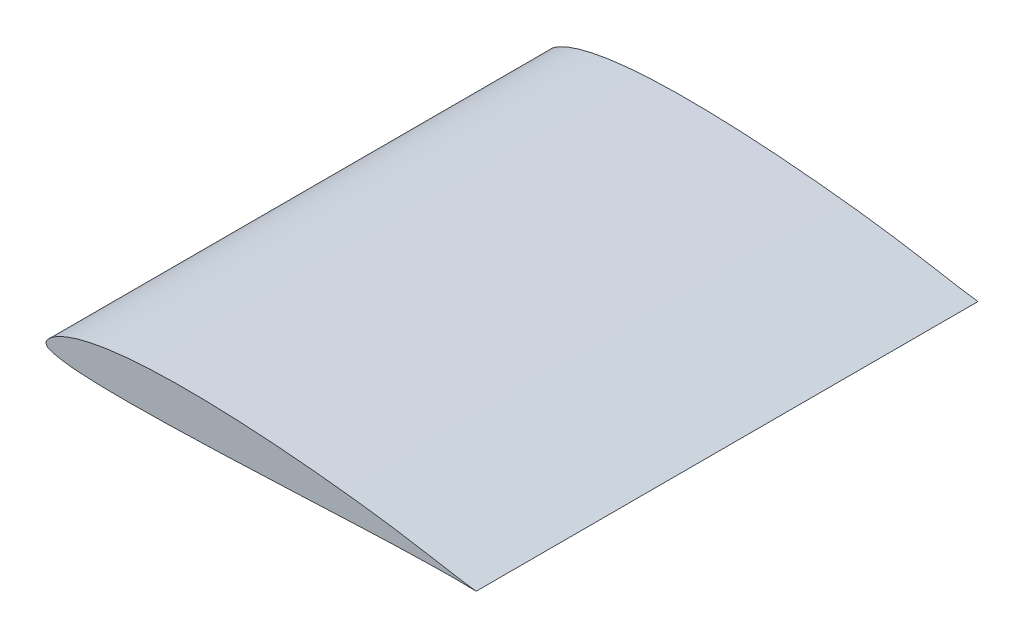
ISO-10303-21;
HEADER;
FILE_DESCRIPTION(('STEP AP214'),'2;1');
FILE_NAME('part.step','',(''),(''),'','','');
FILE_SCHEMA(('AUTOMOTIVE_DESIGN { 1 0 10303 214 1 1 1 1 }'));
ENDSEC;
DATA;
#1=APPLICATION_CONTEXT('core data for automotive mechanical design processes');
#2=APPLICATION_PROTOCOL_DEFINITION('international standard','automotive_design',2000,#1);
#3=PRODUCT_CONTEXT('',#1,'mechanical');
#4=PRODUCT('Part','Part','',(#3));
#5=PRODUCT_RELATED_PRODUCT_CATEGORY('part','',(#4));
#6=PRODUCT_DEFINITION_FORMATION('','',#4);
#7=PRODUCT_DEFINITION_CONTEXT('part definition',#1,'design');
#8=PRODUCT_DEFINITION('design','',#6,#7);
#9=PRODUCT_DEFINITION_SHAPE('','',#8);
#10=(LENGTH_UNIT() NAMED_UNIT(*) SI_UNIT(.MILLI.,.METRE.));
#11=(NAMED_UNIT(*) PLANE_ANGLE_UNIT() SI_UNIT($,.RADIAN.));
#12=(NAMED_UNIT(*) SI_UNIT($,.STERADIAN.) SOLID_ANGLE_UNIT());
#13=UNCERTAINTY_MEASURE_WITH_UNIT(LENGTH_MEASURE(1.E-05),#10,'distance_accuracy_value','');
#14=(GEOMETRIC_REPRESENTATION_CONTEXT(3) GLOBAL_UNCERTAINTY_ASSIGNED_CONTEXT((#13)) GLOBAL_UNIT_ASSIGNED_CONTEXT((#10,
#11,#12)) REPRESENTATION_CONTEXT('',''));
#15=CARTESIAN_POINT('',(0.,0.,0.));
#16=DIRECTION('',(0.,0.,1.));
#17=DIRECTION('',(1.,0.,0.));
#18=AXIS2_PLACEMENT_3D('',#15,#16,#17);
#19=CARTESIAN_POINT('',(151.898604,0.02286,177.8));
#20=DIRECTION('',(0.0455453922574668,0.998962270180468,0.));
#21=DIRECTION('',(-0.998962270180468,0.0455453922574668,0.));
#22=AXIS2_PLACEMENT_3D('',#19,#20,#21);
#23=PLANE('',#22);
#24=CARTESIAN_POINT('',(151.898604,0.02286,0.));
#25=CARTESIAN_POINT('',(152.4,0.,0.));
#26=B_SPLINE_CURVE_WITH_KNOTS('',1,(#24,#25),.UNSPECIFIED.,.F.,.F.,(2,2),(0.,1.),.UNSPECIFIED.);
#27=CARTESIAN_POINT('',(151.898604,0.02286,0.));
#28=VERTEX_POINT('',#27);
#29=CARTESIAN_POINT('',(152.4,0.,0.));
#30=VERTEX_POINT('',#29);
#31=EDGE_CURVE('E74',#28,#30,#26,.T.);
#32=ORIENTED_EDGE('',*,*,#31,.T.);
#33=DIRECTION('',(0.,0.,-1.));
#34=VECTOR('',#33,1.);
#35=CARTESIAN_POINT('',(152.4,0.,177.8));
#36=LINE('',#35,#34);
#37=CARTESIAN_POINT('',(152.4,0.,177.8));
#38=VERTEX_POINT('',#37);
#39=EDGE_CURVE('E11',#38,#30,#36,.T.);
#40=ORIENTED_EDGE('',*,*,#39,.F.);
#41=CARTESIAN_POINT('',(151.898604,0.02286,177.8));
#42=CARTESIAN_POINT('',(152.4,0.,177.8));
#43=B_SPLINE_CURVE_WITH_KNOTS('',1,(#41,#42),.UNSPECIFIED.,.F.,.F.,(2,2),(0.,1.),.UNSPECIFIED.);
#44=CARTESIAN_POINT('',(151.898604,0.02286,177.8));
#45=VERTEX_POINT('',#44);
#46=EDGE_CURVE('E73',#45,#38,#43,.T.);
#47=ORIENTED_EDGE('',*,*,#46,.F.);
#48=DIRECTION('',(0.,0.,-1.));
#49=VECTOR('',#48,1.);
#50=CARTESIAN_POINT('',(151.898604,0.02286,177.8));
#51=LINE('',#50,#49);
#52=EDGE_CURVE('E51',#45,#28,#51,.T.);
#53=ORIENTED_EDGE('',*,*,#52,.T.);
#54=EDGE_LOOP('',(#32,#40,#47,#53));
#55=FACE_BOUND('',#54,.T.);
#56=ADVANCED_FACE('F43',(#55),#23,.F.);
#57=CARTESIAN_POINT('',(152.4,0.,177.8));
#58=CARTESIAN_POINT('',(152.232833718495,0.0185024145844094,177.8));
#59=CARTESIAN_POINT('',(151.571843934071,0.0916625454276125,177.8));
#60=CARTESIAN_POINT('',(150.11399955714,0.283859600165364,177.8));
#61=CARTESIAN_POINT('',(147.749385864208,0.638650628689324,177.8));
#62=CARTESIAN_POINT('',(144.555943785527,1.17015700229937,177.8));
#63=CARTESIAN_POINT('',(140.615360499081,1.85909924705757,177.8));
#64=CARTESIAN_POINT('',(136.007834995224,2.67146012975516,177.8));
#65=CARTESIAN_POINT('',(130.806388018581,3.56284001663103,177.8));
#66=CARTESIAN_POINT('',(125.073826155466,4.48615477740971,177.8));
#67=CARTESIAN_POINT('',(118.8646901353,5.39775327756707,177.8));
#68=CARTESIAN_POINT('',(112.233312125261,6.27297423591478,177.8));
#69=CARTESIAN_POINT('',(105.243489487442,7.10605889156724,177.8));
#70=CARTESIAN_POINT('',(97.9696654062804,7.88931969327321,177.8));
#71=CARTESIAN_POINT('',(90.4927249927246,8.60673485806436,177.8));
#72=CARTESIAN_POINT('',(82.8952532405217,9.2406702507931,177.8));
#73=CARTESIAN_POINT('',(75.2586679023908,9.77749908015344,177.8));
#74=CARTESIAN_POINT('',(67.6629284232157,10.1988157178373,177.8));
#75=CARTESIAN_POINT('',(60.1868274986299,10.4917010195868,177.8));
#76=CARTESIAN_POINT('',(52.9059459542408,10.6450800985298,177.8));
#77=CARTESIAN_POINT('',(45.8917437129946,10.6445518064523,177.8));
#78=CARTESIAN_POINT('',(39.2106810479072,10.4862475970987,177.8));
#79=CARTESIAN_POINT('',(32.923263797137,10.1644127111138,177.8));
#80=CARTESIAN_POINT('',(27.0837008540271,9.67093972647032,177.8));
#81=CARTESIAN_POINT('',(21.737197539699,9.01650809069112,177.8));
#82=CARTESIAN_POINT('',(16.9243447592619,8.20408197388868,177.8));
#83=CARTESIAN_POINT('',(12.6762753048712,7.24977047946681,177.8));
#84=CARTESIAN_POINT('',(9.01981569255257,6.17445777095632,177.8));
#85=CARTESIAN_POINT('',(5.96569481917708,5.00201852215155,177.8));
#86=CARTESIAN_POINT('',(3.54403253695888,3.76987152616717,177.8));
#87=CARTESIAN_POINT('',(1.70483470840094,2.53149972603197,177.8));
#88=CARTESIAN_POINT('',(0.575239505776366,1.34473752883143,177.8));
#89=CARTESIAN_POINT('',(-0.170728015466049,0.203106959768801,177.8));
#90=CARTESIAN_POINT('',(0.337603285303623,-1.00177222805816,177.8));
#91=CARTESIAN_POINT('',(1.79294322608063,-1.54672679451716,177.8));
#92=CARTESIAN_POINT('',(3.794232234597,-2.17716445974196,177.8));
#93=CARTESIAN_POINT('',(6.64340020089969,-2.64392231576436,177.8));
#94=CARTESIAN_POINT('',(10.2161106536038,-3.04195363150428,177.8));
#95=CARTESIAN_POINT('',(14.5300841872538,-3.31987222771604,177.8));
#96=CARTESIAN_POINT('',(19.5339696288078,-3.49767725483492,177.8));
#97=CARTESIAN_POINT('',(25.1869220599411,-3.57763834503169,177.8));
#98=CARTESIAN_POINT('',(31.42862727455,-3.57384808178261,177.8));
#99=CARTESIAN_POINT('',(38.191948203283,-3.49658144160037,177.8));
#100=CARTESIAN_POINT('',(45.4015953170636,-3.34930898576548,177.8));
#101=CARTESIAN_POINT('',(52.9784172595709,-3.14184128811128,177.8));
#102=CARTESIAN_POINT('',(60.8386741403337,-2.88526226056694,177.8));
#103=CARTESIAN_POINT('',(68.8949884243473,-2.58793090460575,177.8));
#104=CARTESIAN_POINT('',(77.057432025165,-2.25888288701279,177.8));
#105=CARTESIAN_POINT('',(85.2350096722083,-1.90773028344113,177.8));
#106=CARTESIAN_POINT('',(93.3354268335371,-1.55016881909302,177.8));
#107=CARTESIAN_POINT('',(101.266049648543,-1.19546522084977,177.8));
#108=CARTESIAN_POINT('',(108.934170809505,-0.862411005508114,177.8));
#109=CARTESIAN_POINT('',(116.246498600348,-0.557504044589403,177.8));
#110=CARTESIAN_POINT('',(123.110150898588,-0.3069361826572,177.8));
#111=CARTESIAN_POINT('',(129.431690532645,-0.107922528146747,177.8));
#112=CARTESIAN_POINT('',(135.123521438346,0.0279744509983298,177.8));
#113=CARTESIAN_POINT('',(140.103603919286,0.108900524885163,177.8));
#114=CARTESIAN_POINT('',(144.299415419815,0.139938590331548,177.8));
#115=CARTESIAN_POINT('',(147.644768246445,0.124243060792821,177.8));
#116=CARTESIAN_POINT('',(150.083437285214,0.0865028877410205,177.8));
#117=CARTESIAN_POINT('',(151.399782071317,0.0403495604636981,177.8));
#118=CARTESIAN_POINT('',(151.898604,0.02286,177.8));
#119=B_SPLINE_CURVE_WITH_KNOTS('',3,(#57,#58,#59,#60,#61,#62,#63,#64,#65,#66,#67,#68,#69,#70,
#71,#72,#73,#74,#75,#76,#77,#78,#79,#80,#81,#82,#83,#84,#85,#86,#87,#88,#89,#90,#91,#92,#93,#94,
#95,#96,#97,#98,#99,#100,#101,#102,#103,#104,#105,#106,#107,#108,#109,#110,#111,#112,#113,#114,
#115,#116,#117,#118),.UNSPECIFIED.,.F.,.F.,(4,1,1,1,1,1,1,1,1,1,1,1,1,1,1,1,1,1,1,1,1,1,1,1,1,1,
1,1,1,1,1,1,1,1,1,1,1,1,1,1,1,1,1,1,1,1,1,1,1,1,1,1,1,1,1,1,1,1,1,4),(0.,0.00163535583425865,
0.00646633693476808,0.0142965918772176,0.0248842088552096,0.0379439925510076,0.0531941368467982,
0.0703765688743697,0.0892572179770476,0.109651763058439,0.131396199224683,0.154294670265703,
0.178096902835303,0.202530723472683,0.227328973387424,0.25222580652472,0.276966075496197,
0.301296827478668,0.324972088966137,0.347773045551505,0.369493848961825,0.389946984550237,
0.40897941596321,0.426465789850067,0.442306728816157,0.456421239565711,0.46877353813753,
0.47934514980936,0.488155641306995,0.495223141471028,0.500608247512498,0.504417035913407,
0.507344225330662,0.511892730711683,0.518766332626908,0.528062399813873,0.5397504852938,
0.553781923901918,0.570059197087642,0.588441486429501,0.608747967256935,0.630750043644814,
0.654207709776473,0.678865071069041,0.704450570233279,0.73067750330715,0.757253936726054,
0.783882586633168,0.810265561255861,0.836095192051152,0.861073222293053,0.884896986100605,
0.907258357413886,0.927856250220039,0.946394646161361,0.962618153964165,0.976286171395788,
0.987192827864271,0.995146789524168,1.),.UNSPECIFIED.);
#120=DIRECTION('',(0.,0.,-1.));
#121=VECTOR('',#120,1.);
#122=SURFACE_OF_LINEAR_EXTRUSION('',#119,#121);
#123=CARTESIAN_POINT('',(152.4,0.,0.));
#124=CARTESIAN_POINT('',(152.232833718495,0.0185024145844094,0.));
#125=CARTESIAN_POINT('',(151.571843934071,0.0916625454276125,0.));
#126=CARTESIAN_POINT('',(150.11399955714,0.283859600165364,0.));
#127=CARTESIAN_POINT('',(147.749385864208,0.638650628689324,0.));
#128=CARTESIAN_POINT('',(144.555943785527,1.17015700229937,0.));
#129=CARTESIAN_POINT('',(140.615360499081,1.85909924705757,0.));
#130=CARTESIAN_POINT('',(136.007834995224,2.67146012975516,0.));
#131=CARTESIAN_POINT('',(130.806388018581,3.56284001663103,0.));
#132=CARTESIAN_POINT('',(125.073826155466,4.48615477740971,0.));
#133=CARTESIAN_POINT('',(118.8646901353,5.39775327756707,0.));
#134=CARTESIAN_POINT('',(112.233312125261,6.27297423591478,0.));
#135=CARTESIAN_POINT('',(105.243489487442,7.10605889156724,0.));
#136=CARTESIAN_POINT('',(97.9696654062804,7.88931969327321,0.));
#137=CARTESIAN_POINT('',(90.4927249927246,8.60673485806436,0.));
#138=CARTESIAN_POINT('',(82.8952532405217,9.2406702507931,0.));
#139=CARTESIAN_POINT('',(75.2586679023908,9.77749908015344,0.));
#140=CARTESIAN_POINT('',(67.6629284232157,10.1988157178373,0.));
#141=CARTESIAN_POINT('',(60.1868274986299,10.4917010195868,0.));
#142=CARTESIAN_POINT('',(52.9059459542408,10.6450800985298,0.));
#143=CARTESIAN_POINT('',(45.8917437129946,10.6445518064523,0.));
#144=CARTESIAN_POINT('',(39.2106810479072,10.4862475970987,0.));
#145=CARTESIAN_POINT('',(32.923263797137,10.1644127111138,0.));
#146=CARTESIAN_POINT('',(27.0837008540271,9.67093972647032,0.));
#147=CARTESIAN_POINT('',(21.737197539699,9.01650809069112,0.));
#148=CARTESIAN_POINT('',(16.9243447592619,8.20408197388868,0.));
#149=CARTESIAN_POINT('',(12.6762753048712,7.24977047946681,0.));
#150=CARTESIAN_POINT('',(9.01981569255257,6.17445777095632,0.));
#151=CARTESIAN_POINT('',(5.96569481917708,5.00201852215155,0.));
#152=CARTESIAN_POINT('',(3.54403253695888,3.76987152616717,0.));
#153=CARTESIAN_POINT('',(1.70483470840094,2.53149972603197,0.));
#154=CARTESIAN_POINT('',(0.575239505776366,1.34473752883143,0.));
#155=CARTESIAN_POINT('',(-0.170728015466049,0.203106959768801,0.));
#156=CARTESIAN_POINT('',(0.337603285303623,-1.00177222805816,0.));
#157=CARTESIAN_POINT('',(1.79294322608063,-1.54672679451716,0.));
#158=CARTESIAN_POINT('',(3.794232234597,-2.17716445974196,0.));
#159=CARTESIAN_POINT('',(6.64340020089969,-2.64392231576436,0.));
#160=CARTESIAN_POINT('',(10.2161106536038,-3.04195363150428,0.));
#161=CARTESIAN_POINT('',(14.5300841872538,-3.31987222771604,0.));
#162=CARTESIAN_POINT('',(19.5339696288078,-3.49767725483492,0.));
#163=CARTESIAN_POINT('',(25.1869220599411,-3.57763834503169,0.));
#164=CARTESIAN_POINT('',(31.42862727455,-3.57384808178261,0.));
#165=CARTESIAN_POINT('',(38.191948203283,-3.49658144160037,0.));
#166=CARTESIAN_POINT('',(45.4015953170636,-3.34930898576548,0.));
#167=CARTESIAN_POINT('',(52.9784172595709,-3.14184128811128,0.));
#168=CARTESIAN_POINT('',(60.8386741403337,-2.88526226056694,0.));
#169=CARTESIAN_POINT('',(68.8949884243473,-2.58793090460575,0.));
#170=CARTESIAN_POINT('',(77.057432025165,-2.25888288701279,0.));
#171=CARTESIAN_POINT('',(85.2350096722083,-1.90773028344113,0.));
#172=CARTESIAN_POINT('',(93.3354268335371,-1.55016881909302,0.));
#173=CARTESIAN_POINT('',(101.266049648543,-1.19546522084977,0.));
#174=CARTESIAN_POINT('',(108.934170809505,-0.862411005508114,0.));
#175=CARTESIAN_POINT('',(116.246498600348,-0.557504044589403,0.));
#176=CARTESIAN_POINT('',(123.110150898588,-0.3069361826572,0.));
#177=CARTESIAN_POINT('',(129.431690532645,-0.107922528146747,0.));
#178=CARTESIAN_POINT('',(135.123521438346,0.0279744509983298,0.));
#179=CARTESIAN_POINT('',(140.103603919286,0.108900524885163,0.));
#180=CARTESIAN_POINT('',(144.299415419815,0.139938590331548,0.));
#181=CARTESIAN_POINT('',(147.644768246445,0.124243060792821,0.));
#182=CARTESIAN_POINT('',(150.083437285214,0.0865028877410205,0.));
#183=CARTESIAN_POINT('',(151.399782071317,0.0403495604636981,0.));
#184=CARTESIAN_POINT('',(151.898604,0.02286,0.));
#185=B_SPLINE_CURVE_WITH_KNOTS('',3,(#123,#124,#125,#126,#127,#128,#129,#130,#131,#132,#133,
#134,#135,#136,#137,#138,#139,#140,#141,#142,#143,#144,#145,#146,#147,#148,#149,#150,#151,#152,
#153,#154,#155,#156,#157,#158,#159,#160,#161,#162,#163,#164,#165,#166,#167,#168,#169,#170,#171,
#172,#173,#174,#175,#176,#177,#178,#179,#180,#181,#182,#183,#184),.UNSPECIFIED.,.F.,.F.,(4,1,1,
1,1,1,1,1,1,1,1,1,1,1,1,1,1,1,1,1,1,1,1,1,1,1,1,1,1,1,1,1,1,1,1,1,1,1,1,1,1,1,1,1,1,1,1,1,1,1,1,
1,1,1,1,1,1,1,1,4),(0.,0.00163535583425865,0.00646633693476808,0.0142965918772176,
0.0248842088552096,0.0379439925510076,0.0531941368467982,0.0703765688743697,0.0892572179770476,
0.109651763058439,0.131396199224683,0.154294670265703,0.178096902835303,0.202530723472683,
0.227328973387424,0.25222580652472,0.276966075496197,0.301296827478668,0.324972088966137,
0.347773045551505,0.369493848961825,0.389946984550237,0.40897941596321,0.426465789850067,
0.442306728816157,0.456421239565711,0.46877353813753,0.47934514980936,0.488155641306995,
0.495223141471028,0.500608247512498,0.504417035913407,0.507344225330662,0.511892730711683,
0.518766332626908,0.528062399813873,0.5397504852938,0.553781923901918,0.570059197087642,
0.588441486429501,0.608747967256935,0.630750043644814,0.654207709776473,0.678865071069041,
0.704450570233279,0.73067750330715,0.757253936726054,0.783882586633168,0.810265561255861,
0.836095192051152,0.861073222293053,0.884896986100605,0.907258357413886,0.927856250220039,
0.946394646161361,0.962618153964165,0.976286171395788,0.987192827864271,0.995146789524168,1.),.UNSPECIFIED.);
#186=EDGE_CURVE('E66',#30,#28,#185,.T.);
#187=ORIENTED_EDGE('',*,*,#186,.T.);
#188=ORIENTED_EDGE('',*,*,#52,.F.);
#189=EDGE_CURVE('E58',#38,#45,#119,.T.);
#190=ORIENTED_EDGE('',*,*,#189,.F.);
#191=ORIENTED_EDGE('',*,*,#39,.T.);
#192=EDGE_LOOP('',(#187,#188,#190,#191));
#193=FACE_BOUND('',#192,.T.);
#194=ADVANCED_FACE('F69',(#193),#122,.F.);
#195=CARTESIAN_POINT('',(0.609994043917484,1.31613343449531,177.8));
#196=DIRECTION('',(0.,0.,1.));
#197=DIRECTION('',(1.,0.,0.));
#198=AXIS2_PLACEMENT_3D('',#195,#196,#197);
#199=PLANE('',#198);
#200=ORIENTED_EDGE('',*,*,#46,.T.);
#201=ORIENTED_EDGE('',*,*,#189,.T.);
#202=EDGE_LOOP('',(#200,#201));
#203=FACE_BOUND('',#202,.T.);
#204=ADVANCED_FACE('F101',(#203),#199,.T.);
#205=CARTESIAN_POINT('',(0.609994043917484,1.31613343449531,0.));
#206=DIRECTION('',(0.,0.,1.));
#207=DIRECTION('',(1.,0.,0.));
#208=AXIS2_PLACEMENT_3D('',#205,#206,#207);
#209=PLANE('',#208);
#210=ORIENTED_EDGE('',*,*,#31,.F.);
#211=ORIENTED_EDGE('',*,*,#186,.F.);
#212=EDGE_LOOP('',(#210,#211));
#213=FACE_BOUND('',#212,.T.);
#214=ADVANCED_FACE('F77',(#213),#209,.F.);
#215=CLOSED_SHELL('',(#56,#194,#204,#214));
#216=MANIFOLD_SOLID_BREP('B2',#215);
#217=ADVANCED_BREP_SHAPE_REPRESENTATION('',(#18,#216),#14);
#218=SHAPE_DEFINITION_REPRESENTATION(#9,#217);
ENDSEC;
END-ISO-10303-21;
